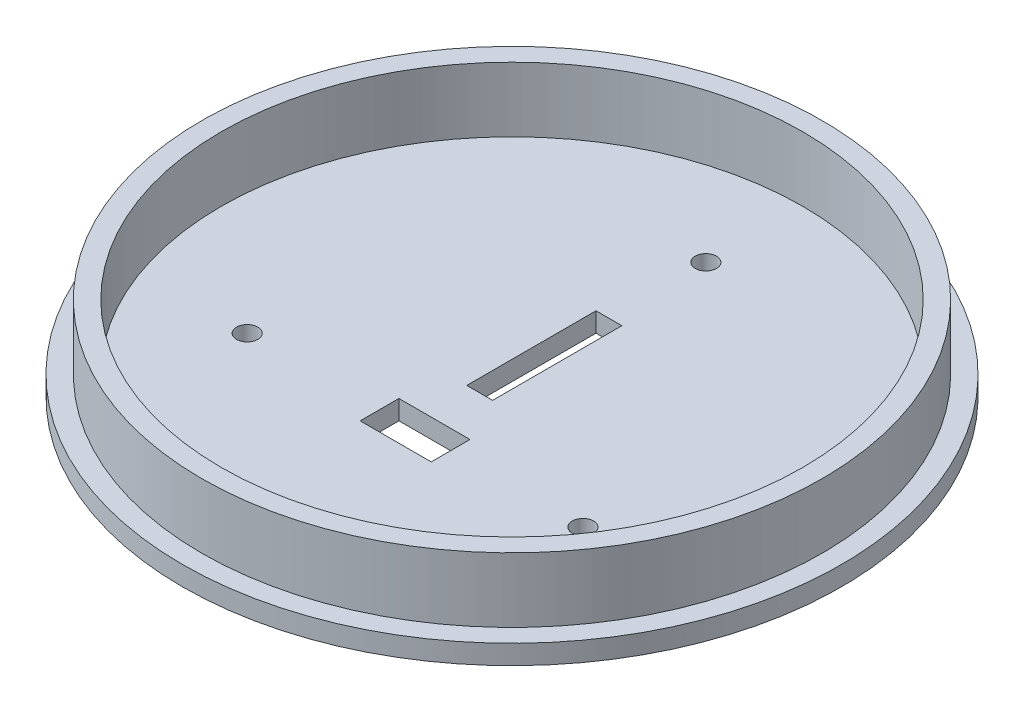
ISO-10303-21;
HEADER;
FILE_DESCRIPTION(('STEP AP214'),'2;1');
FILE_NAME('part.step','',(''),(''),'','','');
FILE_SCHEMA(('AUTOMOTIVE_DESIGN { 1 0 10303 214 1 1 1 1 }'));
ENDSEC;
DATA;
#1=APPLICATION_CONTEXT('core data for automotive mechanical design processes');
#2=APPLICATION_PROTOCOL_DEFINITION('international standard','automotive_design',2000,#1);
#3=PRODUCT_CONTEXT('',#1,'mechanical');
#4=PRODUCT('Part','Part','',(#3));
#5=PRODUCT_RELATED_PRODUCT_CATEGORY('part','',(#4));
#6=PRODUCT_DEFINITION_FORMATION('','',#4);
#7=PRODUCT_DEFINITION_CONTEXT('part definition',#1,'design');
#8=PRODUCT_DEFINITION('design','',#6,#7);
#9=PRODUCT_DEFINITION_SHAPE('','',#8);
#10=(LENGTH_UNIT() NAMED_UNIT(*) SI_UNIT(.MILLI.,.METRE.));
#11=(NAMED_UNIT(*) PLANE_ANGLE_UNIT() SI_UNIT($,.RADIAN.));
#12=(NAMED_UNIT(*) SI_UNIT($,.STERADIAN.) SOLID_ANGLE_UNIT());
#13=UNCERTAINTY_MEASURE_WITH_UNIT(LENGTH_MEASURE(1.E-05),#10,'distance_accuracy_value','');
#14=(GEOMETRIC_REPRESENTATION_CONTEXT(3) GLOBAL_UNCERTAINTY_ASSIGNED_CONTEXT((#13)) GLOBAL_UNIT_ASSIGNED_CONTEXT((#10,
#11,#12)) REPRESENTATION_CONTEXT('',''));
#15=CARTESIAN_POINT('',(0.,0.,0.));
#16=DIRECTION('',(0.,0.,1.));
#17=DIRECTION('',(1.,0.,0.));
#18=AXIS2_PLACEMENT_3D('',#15,#16,#17);
#19=CARTESIAN_POINT('',(0.,3.,0.));
#20=DIRECTION('',(0.,-1.,0.));
#21=DIRECTION('',(0.,0.,-1.));
#22=AXIS2_PLACEMENT_3D('',#19,#20,#21);
#23=CYLINDRICAL_SURFACE('',#22,51.);
#24=CARTESIAN_POINT('',(0.,3.,0.));
#25=DIRECTION('',(0.,1.,0.));
#26=DIRECTION('',(0.,0.,1.));
#27=AXIS2_PLACEMENT_3D('',#24,#25,#26);
#28=CIRCLE('',#27,51.);
#29=CARTESIAN_POINT('',(0.,3.,51.));
#30=VERTEX_POINT('',#29);
#31=EDGE_CURVE('E49',#30,#30,#28,.T.);
#32=ORIENTED_EDGE('',*,*,#31,.F.);
#33=EDGE_LOOP('',(#32));
#34=FACE_BOUND('',#33,.T.);
#35=CARTESIAN_POINT('',(0.,0.,0.));
#36=DIRECTION('',(0.,1.,0.));
#37=DIRECTION('',(0.,0.,1.));
#38=AXIS2_PLACEMENT_3D('',#35,#36,#37);
#39=CIRCLE('',#38,51.);
#40=CARTESIAN_POINT('',(0.,0.,51.));
#41=VERTEX_POINT('',#40);
#42=EDGE_CURVE('E201',#41,#41,#39,.T.);
#43=ORIENTED_EDGE('',*,*,#42,.T.);
#44=EDGE_LOOP('',(#43));
#45=FACE_BOUND('',#44,.T.);
#46=ADVANCED_FACE('F42',(#34,#45),#23,.T.);
#47=CARTESIAN_POINT('',(0.,3.,0.));
#48=DIRECTION('',(0.,1.,0.));
#49=DIRECTION('',(0.,0.,1.));
#50=AXIS2_PLACEMENT_3D('',#47,#48,#49);
#51=PLANE('',#50);
#52=CARTESIAN_POINT('',(0.,3.,0.));
#53=DIRECTION('',(0.,1.,0.));
#54=DIRECTION('',(0.,0.,1.));
#55=AXIS2_PLACEMENT_3D('',#52,#53,#54);
#56=CIRCLE('',#55,48.);
#57=CARTESIAN_POINT('',(0.,3.,48.));
#58=VERTEX_POINT('',#57);
#59=EDGE_CURVE('E194',#58,#58,#56,.T.);
#60=ORIENTED_EDGE('',*,*,#59,.F.);
#61=EDGE_LOOP('',(#60));
#62=FACE_BOUND('',#61,.T.);
#63=ORIENTED_EDGE('',*,*,#31,.T.);
#64=EDGE_LOOP('',(#63));
#65=FACE_BOUND('',#64,.T.);
#66=ADVANCED_FACE('F212',(#62,#65),#51,.T.);
#67=CARTESIAN_POINT('',(0.,0.,0.));
#68=DIRECTION('',(0.,1.,0.));
#69=DIRECTION('',(0.,0.,1.));
#70=AXIS2_PLACEMENT_3D('',#67,#68,#69);
#71=PLANE('',#70);
#72=DIRECTION('',(1.,0.,0.));
#73=VECTOR('',#72,1.);
#74=CARTESIAN_POINT('',(0.,0.,5.00000000000003));
#75=LINE('',#74,#73);
#76=CARTESIAN_POINT('',(-2.,0.,5.00000000000003));
#77=VERTEX_POINT('',#76);
#78=CARTESIAN_POINT('',(2.,0.,5.00000000000003));
#79=VERTEX_POINT('',#78);
#80=EDGE_CURVE('E170',#77,#79,#75,.T.);
#81=ORIENTED_EDGE('',*,*,#80,.T.);
#82=DIRECTION('',(0.,0.,-1.));
#83=VECTOR('',#82,1.);
#84=CARTESIAN_POINT('',(2.,0.,0.));
#85=LINE('',#84,#83);
#86=CARTESIAN_POINT('',(2.,0.,-15.));
#87=VERTEX_POINT('',#86);
#88=EDGE_CURVE('E173',#79,#87,#85,.T.);
#89=ORIENTED_EDGE('',*,*,#88,.T.);
#90=DIRECTION('',(-1.,0.,0.));
#91=VECTOR('',#90,1.);
#92=CARTESIAN_POINT('',(0.,0.,-15.));
#93=LINE('',#92,#91);
#94=CARTESIAN_POINT('',(-2.,0.,-15.));
#95=VERTEX_POINT('',#94);
#96=EDGE_CURVE('E167',#87,#95,#93,.T.);
#97=ORIENTED_EDGE('',*,*,#96,.T.);
#98=DIRECTION('',(0.,0.,1.));
#99=VECTOR('',#98,1.);
#100=CARTESIAN_POINT('',(-2.,0.,0.));
#101=LINE('',#100,#99);
#102=EDGE_CURVE('E111',#95,#77,#101,.T.);
#103=ORIENTED_EDGE('',*,*,#102,.T.);
#104=EDGE_LOOP('',(#81,#89,#97,#103));
#105=FACE_BOUND('',#104,.T.);
#106=DIRECTION('',(1.,0.,0.));
#107=VECTOR('',#106,1.);
#108=CARTESIAN_POINT('',(0.,0.,18.0000000000001));
#109=LINE('',#108,#107);
#110=CARTESIAN_POINT('',(-5.5,0.,18.0000000000001));
#111=VERTEX_POINT('',#110);
#112=CARTESIAN_POINT('',(5.5,0.,18.0000000000001));
#113=VERTEX_POINT('',#112);
#114=EDGE_CURVE('E161',#111,#113,#109,.T.);
#115=ORIENTED_EDGE('',*,*,#114,.T.);
#116=DIRECTION('',(0.,0.,-1.));
#117=VECTOR('',#116,1.);
#118=CARTESIAN_POINT('',(5.5,0.,0.));
#119=LINE('',#118,#117);
#120=CARTESIAN_POINT('',(5.5,0.,12.0000000000001));
#121=VERTEX_POINT('',#120);
#122=EDGE_CURVE('E164',#113,#121,#119,.T.);
#123=ORIENTED_EDGE('',*,*,#122,.T.);
#124=DIRECTION('',(-1.,0.,0.));
#125=VECTOR('',#124,1.);
#126=CARTESIAN_POINT('',(0.,0.,12.0000000000001));
#127=LINE('',#126,#125);
#128=CARTESIAN_POINT('',(-5.5,0.,12.0000000000001));
#129=VERTEX_POINT('',#128);
#130=EDGE_CURVE('E135',#121,#129,#127,.T.);
#131=ORIENTED_EDGE('',*,*,#130,.T.);
#132=DIRECTION('',(0.,0.,1.));
#133=VECTOR('',#132,1.);
#134=CARTESIAN_POINT('',(-5.5,0.,0.));
#135=LINE('',#134,#133);
#136=EDGE_CURVE('E158',#129,#111,#135,.T.);
#137=ORIENTED_EDGE('',*,*,#136,.T.);
#138=EDGE_LOOP('',(#115,#123,#131,#137));
#139=FACE_BOUND('',#138,.T.);
#140=CARTESIAN_POINT('',(-25.9807621135331,0.,15.0000000000001));
#141=DIRECTION('',(0.,1.,0.));
#142=DIRECTION('',(0.,0.,1.));
#143=AXIS2_PLACEMENT_3D('',#140,#141,#142);
#144=CIRCLE('',#143,1.65);
#145=CARTESIAN_POINT('',(-25.9807621135331,0.,16.6500000000001));
#146=VERTEX_POINT('',#145);
#147=EDGE_CURVE('E185',#146,#146,#144,.T.);
#148=ORIENTED_EDGE('',*,*,#147,.T.);
#149=EDGE_LOOP('',(#148));
#150=FACE_BOUND('',#149,.T.);
#151=CARTESIAN_POINT('',(25.9807621135333,0.,14.9999999999998));
#152=DIRECTION('',(0.,1.,0.));
#153=DIRECTION('',(0.,0.,1.));
#154=AXIS2_PLACEMENT_3D('',#151,#152,#153);
#155=CIRCLE('',#154,1.65);
#156=CARTESIAN_POINT('',(25.9807621135333,0.,16.6499999999998));
#157=VERTEX_POINT('',#156);
#158=EDGE_CURVE('E180',#157,#157,#155,.T.);
#159=ORIENTED_EDGE('',*,*,#158,.T.);
#160=EDGE_LOOP('',(#159));
#161=FACE_BOUND('',#160,.T.);
#162=CARTESIAN_POINT('',(0.,0.,-30.));
#163=DIRECTION('',(0.,1.,0.));
#164=DIRECTION('',(0.,0.,1.));
#165=AXIS2_PLACEMENT_3D('',#162,#163,#164);
#166=CIRCLE('',#165,1.65);
#167=CARTESIAN_POINT('',(0.,0.,-28.35));
#168=VERTEX_POINT('',#167);
#169=EDGE_CURVE('E191',#168,#168,#166,.T.);
#170=ORIENTED_EDGE('',*,*,#169,.T.);
#171=EDGE_LOOP('',(#170));
#172=FACE_BOUND('',#171,.T.);
#173=ORIENTED_EDGE('',*,*,#42,.F.);
#174=EDGE_LOOP('',(#173));
#175=FACE_BOUND('',#174,.T.);
#176=ADVANCED_FACE('F209',(#105,#139,#150,#161,#172,#175),#71,.F.);
#177=CARTESIAN_POINT('',(0.,13.,0.));
#178=DIRECTION('',(0.,-1.,0.));
#179=DIRECTION('',(0.,0.,-1.));
#180=AXIS2_PLACEMENT_3D('',#177,#178,#179);
#181=CYLINDRICAL_SURFACE('',#180,45.);
#182=CARTESIAN_POINT('',(0.,13.,0.));
#183=DIRECTION('',(0.,1.,0.));
#184=DIRECTION('',(0.,0.,1.));
#185=AXIS2_PLACEMENT_3D('',#182,#183,#184);
#186=CIRCLE('',#185,45.);
#187=CARTESIAN_POINT('',(0.,13.,45.));
#188=VERTEX_POINT('',#187);
#189=EDGE_CURVE('E195',#188,#188,#186,.T.);
#190=ORIENTED_EDGE('',*,*,#189,.T.);
#191=EDGE_LOOP('',(#190));
#192=FACE_BOUND('',#191,.T.);
#193=CARTESIAN_POINT('',(0.,3.,0.));
#194=DIRECTION('',(0.,1.,0.));
#195=DIRECTION('',(0.,0.,1.));
#196=AXIS2_PLACEMENT_3D('',#193,#194,#195);
#197=CIRCLE('',#196,45.);
#198=CARTESIAN_POINT('',(0.,3.,45.));
#199=VERTEX_POINT('',#198);
#200=EDGE_CURVE('E11',#199,#199,#197,.F.);
#201=ORIENTED_EDGE('',*,*,#200,.T.);
#202=EDGE_LOOP('',(#201));
#203=FACE_BOUND('',#202,.T.);
#204=ADVANCED_FACE('F211',(#192,#203),#181,.F.);
#205=CARTESIAN_POINT('',(0.,13.,0.));
#206=DIRECTION('',(0.,-1.,0.));
#207=DIRECTION('',(0.,0.,-1.));
#208=AXIS2_PLACEMENT_3D('',#205,#206,#207);
#209=CYLINDRICAL_SURFACE('',#208,48.);
#210=CARTESIAN_POINT('',(0.,13.,0.));
#211=DIRECTION('',(0.,1.,0.));
#212=DIRECTION('',(0.,0.,1.));
#213=AXIS2_PLACEMENT_3D('',#210,#211,#212);
#214=CIRCLE('',#213,48.);
#215=CARTESIAN_POINT('',(0.,13.,48.));
#216=VERTEX_POINT('',#215);
#217=EDGE_CURVE('E198',#216,#216,#214,.T.);
#218=ORIENTED_EDGE('',*,*,#217,.F.);
#219=EDGE_LOOP('',(#218));
#220=FACE_BOUND('',#219,.T.);
#221=ORIENTED_EDGE('',*,*,#59,.T.);
#222=EDGE_LOOP('',(#221));
#223=FACE_BOUND('',#222,.T.);
#224=ADVANCED_FACE('F218',(#220,#223),#209,.T.);
#225=CARTESIAN_POINT('',(0.,13.,0.));
#226=DIRECTION('',(0.,1.,0.));
#227=DIRECTION('',(0.,0.,1.));
#228=AXIS2_PLACEMENT_3D('',#225,#226,#227);
#229=PLANE('',#228);
#230=ORIENTED_EDGE('',*,*,#189,.F.);
#231=EDGE_LOOP('',(#230));
#232=FACE_BOUND('',#231,.T.);
#233=ORIENTED_EDGE('',*,*,#217,.T.);
#234=EDGE_LOOP('',(#233));
#235=FACE_BOUND('',#234,.T.);
#236=ADVANCED_FACE('F253',(#232,#235),#229,.T.);
#237=DIRECTION('',(0.,0.,-1.));
#238=VECTOR('',#237,1.);
#239=CARTESIAN_POINT('',(2.,3.,5.00000000000003));
#240=LINE('',#239,#238);
#241=CARTESIAN_POINT('',(2.,3.,5.00000000000003));
#242=VERTEX_POINT('',#241);
#243=CARTESIAN_POINT('',(2.,3.,-15.));
#244=VERTEX_POINT('',#243);
#245=EDGE_CURVE('E123',#242,#244,#240,.T.);
#246=ORIENTED_EDGE('',*,*,#245,.F.);
#247=DIRECTION('',(1.,0.,0.));
#248=VECTOR('',#247,1.);
#249=CARTESIAN_POINT('',(-2.,3.,5.00000000000003));
#250=LINE('',#249,#248);
#251=CARTESIAN_POINT('',(-2.,3.,5.00000000000003));
#252=VERTEX_POINT('',#251);
#253=EDGE_CURVE('E128',#252,#242,#250,.T.);
#254=ORIENTED_EDGE('',*,*,#253,.F.);
#255=DIRECTION('',(0.,0.,1.));
#256=VECTOR('',#255,1.);
#257=CARTESIAN_POINT('',(-2.,3.,5.00000000000003));
#258=LINE('',#257,#256);
#259=CARTESIAN_POINT('',(-2.,3.,-15.));
#260=VERTEX_POINT('',#259);
#261=EDGE_CURVE('E108',#260,#252,#258,.T.);
#262=ORIENTED_EDGE('',*,*,#261,.F.);
#263=DIRECTION('',(-1.,0.,0.));
#264=VECTOR('',#263,1.);
#265=CARTESIAN_POINT('',(-2.,3.,-15.));
#266=LINE('',#265,#264);
#267=EDGE_CURVE('E118',#244,#260,#266,.T.);
#268=ORIENTED_EDGE('',*,*,#267,.F.);
#269=EDGE_LOOP('',(#246,#254,#262,#268));
#270=FACE_BOUND('',#269,.T.);
#271=DIRECTION('',(0.,0.,-1.));
#272=VECTOR('',#271,1.);
#273=CARTESIAN_POINT('',(5.5,3.,12.0000000000001));
#274=LINE('',#273,#272);
#275=CARTESIAN_POINT('',(5.5,3.,18.0000000000001));
#276=VERTEX_POINT('',#275);
#277=CARTESIAN_POINT('',(5.5,3.,12.0000000000001));
#278=VERTEX_POINT('',#277);
#279=EDGE_CURVE('E154',#276,#278,#274,.T.);
#280=ORIENTED_EDGE('',*,*,#279,.F.);
#281=DIRECTION('',(1.,0.,0.));
#282=VECTOR('',#281,1.);
#283=CARTESIAN_POINT('',(-5.5,3.,18.0000000000001));
#284=LINE('',#283,#282);
#285=CARTESIAN_POINT('',(-5.5,3.,18.0000000000001));
#286=VERTEX_POINT('',#285);
#287=EDGE_CURVE('E141',#286,#276,#284,.T.);
#288=ORIENTED_EDGE('',*,*,#287,.F.);
#289=DIRECTION('',(0.,0.,1.));
#290=VECTOR('',#289,1.);
#291=CARTESIAN_POINT('',(-5.5,3.,12.0000000000001));
#292=LINE('',#291,#290);
#293=CARTESIAN_POINT('',(-5.5,3.,12.0000000000001));
#294=VERTEX_POINT('',#293);
#295=EDGE_CURVE('E149',#294,#286,#292,.T.);
#296=ORIENTED_EDGE('',*,*,#295,.F.);
#297=DIRECTION('',(-1.,0.,0.));
#298=VECTOR('',#297,1.);
#299=CARTESIAN_POINT('',(-5.5,3.,12.0000000000001));
#300=LINE('',#299,#298);
#301=EDGE_CURVE('E152',#278,#294,#300,.T.);
#302=ORIENTED_EDGE('',*,*,#301,.F.);
#303=EDGE_LOOP('',(#280,#288,#296,#302));
#304=FACE_BOUND('',#303,.T.);
#305=CARTESIAN_POINT('',(-25.9807621135331,3.,15.0000000000001));
#306=DIRECTION('',(0.,1.,0.));
#307=DIRECTION('',(0.866025403784436,0.,-0.500000000000004));
#308=AXIS2_PLACEMENT_3D('',#305,#306,#307);
#309=CIRCLE('',#308,1.65);
#310=CARTESIAN_POINT('',(-24.5518201972888,3.,14.1750000000001));
#311=VERTEX_POINT('',#310);
#312=EDGE_CURVE('E177',#311,#311,#309,.T.);
#313=ORIENTED_EDGE('',*,*,#312,.F.);
#314=EDGE_LOOP('',(#313));
#315=FACE_BOUND('',#314,.T.);
#316=CARTESIAN_POINT('',(25.9807621135333,3.,14.9999999999998));
#317=DIRECTION('',(0.,1.,0.));
#318=DIRECTION('',(-0.866025403784443,0.,-0.499999999999992));
#319=AXIS2_PLACEMENT_3D('',#316,#317,#318);
#320=CIRCLE('',#319,1.65);
#321=CARTESIAN_POINT('',(24.551820197289,3.,14.1749999999998));
#322=VERTEX_POINT('',#321);
#323=EDGE_CURVE('E176',#322,#322,#320,.T.);
#324=ORIENTED_EDGE('',*,*,#323,.F.);
#325=EDGE_LOOP('',(#324));
#326=FACE_BOUND('',#325,.T.);
#327=CARTESIAN_POINT('',(0.,3.,-30.));
#328=DIRECTION('',(0.,1.,0.));
#329=DIRECTION('',(0.,0.,1.));
#330=AXIS2_PLACEMENT_3D('',#327,#328,#329);
#331=CIRCLE('',#330,1.65);
#332=CARTESIAN_POINT('',(0.,3.,-28.35));
#333=VERTEX_POINT('',#332);
#334=EDGE_CURVE('E188',#333,#333,#331,.T.);
#335=ORIENTED_EDGE('',*,*,#334,.F.);
#336=EDGE_LOOP('',(#335));
#337=FACE_BOUND('',#336,.T.);
#338=ORIENTED_EDGE('',*,*,#200,.F.);
#339=EDGE_LOOP('',(#338));
#340=FACE_BOUND('',#339,.T.);
#341=ADVANCED_FACE('F125',(#270,#304,#315,#326,#337,#340),#51,.T.);
#342=CARTESIAN_POINT('',(0.,-7.,-30.));
#343=DIRECTION('',(0.,1.,0.));
#344=DIRECTION('',(0.,0.,1.));
#345=AXIS2_PLACEMENT_3D('',#342,#343,#344);
#346=CYLINDRICAL_SURFACE('',#345,1.65);
#347=ORIENTED_EDGE('',*,*,#334,.T.);
#348=EDGE_LOOP('',(#347));
#349=FACE_BOUND('',#348,.T.);
#350=ORIENTED_EDGE('',*,*,#169,.F.);
#351=EDGE_LOOP('',(#350));
#352=FACE_BOUND('',#351,.T.);
#353=ADVANCED_FACE('F272',(#349,#352),#346,.F.);
#354=CARTESIAN_POINT('',(25.9807621135333,-7.,14.9999999999998));
#355=DIRECTION('',(0.,1.,0.));
#356=DIRECTION('',(0.,0.,1.));
#357=AXIS2_PLACEMENT_3D('',#354,#355,#356);
#358=CYLINDRICAL_SURFACE('',#357,1.65);
#359=ORIENTED_EDGE('',*,*,#323,.T.);
#360=EDGE_LOOP('',(#359));
#361=FACE_BOUND('',#360,.T.);
#362=ORIENTED_EDGE('',*,*,#158,.F.);
#363=EDGE_LOOP('',(#362));
#364=FACE_BOUND('',#363,.T.);
#365=ADVANCED_FACE('F276',(#361,#364),#358,.F.);
#366=CARTESIAN_POINT('',(-25.9807621135331,-7.,15.0000000000001));
#367=DIRECTION('',(0.,1.,0.));
#368=DIRECTION('',(0.,0.,1.));
#369=AXIS2_PLACEMENT_3D('',#366,#367,#368);
#370=CYLINDRICAL_SURFACE('',#369,1.65);
#371=ORIENTED_EDGE('',*,*,#312,.T.);
#372=EDGE_LOOP('',(#371));
#373=FACE_BOUND('',#372,.T.);
#374=ORIENTED_EDGE('',*,*,#147,.F.);
#375=EDGE_LOOP('',(#374));
#376=FACE_BOUND('',#375,.T.);
#377=ADVANCED_FACE('F287',(#373,#376),#370,.F.);
#378=CARTESIAN_POINT('',(5.5,-7.,12.0000000000001));
#379=DIRECTION('',(1.,0.,0.));
#380=DIRECTION('',(0.,0.,-1.));
#381=AXIS2_PLACEMENT_3D('',#378,#379,#380);
#382=PLANE('',#381);
#383=DIRECTION('',(0.,1.,0.));
#384=VECTOR('',#383,1.);
#385=CARTESIAN_POINT('',(5.5,-7.,18.0000000000001));
#386=LINE('',#385,#384);
#387=EDGE_CURVE('E145',#113,#276,#386,.T.);
#388=ORIENTED_EDGE('',*,*,#387,.T.);
#389=ORIENTED_EDGE('',*,*,#279,.T.);
#390=DIRECTION('',(0.,1.,0.));
#391=VECTOR('',#390,1.);
#392=CARTESIAN_POINT('',(5.5,-7.,12.0000000000001));
#393=LINE('',#392,#391);
#394=EDGE_CURVE('E138',#121,#278,#393,.T.);
#395=ORIENTED_EDGE('',*,*,#394,.F.);
#396=ORIENTED_EDGE('',*,*,#122,.F.);
#397=EDGE_LOOP('',(#388,#389,#395,#396));
#398=FACE_BOUND('',#397,.T.);
#399=ADVANCED_FACE('F297',(#398),#382,.F.);
#400=CARTESIAN_POINT('',(-5.5,-7.,18.0000000000001));
#401=DIRECTION('',(0.,0.,1.));
#402=DIRECTION('',(1.,0.,0.));
#403=AXIS2_PLACEMENT_3D('',#400,#401,#402);
#404=PLANE('',#403);
#405=DIRECTION('',(0.,1.,0.));
#406=VECTOR('',#405,1.);
#407=CARTESIAN_POINT('',(-5.5,-7.,18.0000000000001));
#408=LINE('',#407,#406);
#409=EDGE_CURVE('E143',#111,#286,#408,.T.);
#410=ORIENTED_EDGE('',*,*,#409,.T.);
#411=ORIENTED_EDGE('',*,*,#287,.T.);
#412=ORIENTED_EDGE('',*,*,#387,.F.);
#413=ORIENTED_EDGE('',*,*,#114,.F.);
#414=EDGE_LOOP('',(#410,#411,#412,#413));
#415=FACE_BOUND('',#414,.T.);
#416=ADVANCED_FACE('F319',(#415),#404,.F.);
#417=CARTESIAN_POINT('',(-5.5,-7.,12.0000000000001));
#418=DIRECTION('',(-1.,0.,0.));
#419=DIRECTION('',(0.,0.,1.));
#420=AXIS2_PLACEMENT_3D('',#417,#418,#419);
#421=PLANE('',#420);
#422=DIRECTION('',(0.,1.,0.));
#423=VECTOR('',#422,1.);
#424=CARTESIAN_POINT('',(-5.5,-7.,12.0000000000001));
#425=LINE('',#424,#423);
#426=EDGE_CURVE('E64',#129,#294,#425,.T.);
#427=ORIENTED_EDGE('',*,*,#426,.T.);
#428=ORIENTED_EDGE('',*,*,#295,.T.);
#429=ORIENTED_EDGE('',*,*,#409,.F.);
#430=ORIENTED_EDGE('',*,*,#136,.F.);
#431=EDGE_LOOP('',(#427,#428,#429,#430));
#432=FACE_BOUND('',#431,.T.);
#433=ADVANCED_FACE('F330',(#432),#421,.F.);
#434=CARTESIAN_POINT('',(-5.5,-7.,12.0000000000001));
#435=DIRECTION('',(0.,0.,-1.));
#436=DIRECTION('',(-1.,0.,0.));
#437=AXIS2_PLACEMENT_3D('',#434,#435,#436);
#438=PLANE('',#437);
#439=ORIENTED_EDGE('',*,*,#394,.T.);
#440=ORIENTED_EDGE('',*,*,#301,.T.);
#441=ORIENTED_EDGE('',*,*,#426,.F.);
#442=ORIENTED_EDGE('',*,*,#130,.F.);
#443=EDGE_LOOP('',(#439,#440,#441,#442));
#444=FACE_BOUND('',#443,.T.);
#445=ADVANCED_FACE('F341',(#444),#438,.F.);
#446=CARTESIAN_POINT('',(2.,-7.,5.00000000000003));
#447=DIRECTION('',(1.,0.,0.));
#448=DIRECTION('',(0.,0.,-1.));
#449=AXIS2_PLACEMENT_3D('',#446,#447,#448);
#450=PLANE('',#449);
#451=DIRECTION('',(0.,1.,0.));
#452=VECTOR('',#451,1.);
#453=CARTESIAN_POINT('',(2.,-7.,5.00000000000003));
#454=LINE('',#453,#452);
#455=EDGE_CURVE('E133',#79,#242,#454,.T.);
#456=ORIENTED_EDGE('',*,*,#455,.T.);
#457=ORIENTED_EDGE('',*,*,#245,.T.);
#458=DIRECTION('',(0.,1.,0.));
#459=VECTOR('',#458,1.);
#460=CARTESIAN_POINT('',(2.,-7.,-15.));
#461=LINE('',#460,#459);
#462=EDGE_CURVE('E114',#87,#244,#461,.T.);
#463=ORIENTED_EDGE('',*,*,#462,.F.);
#464=ORIENTED_EDGE('',*,*,#88,.F.);
#465=EDGE_LOOP('',(#456,#457,#463,#464));
#466=FACE_BOUND('',#465,.T.);
#467=ADVANCED_FACE('F352',(#466),#450,.F.);
#468=CARTESIAN_POINT('',(-2.,-7.,5.00000000000003));
#469=DIRECTION('',(0.,0.,1.));
#470=DIRECTION('',(1.,0.,0.));
#471=AXIS2_PLACEMENT_3D('',#468,#469,#470);
#472=PLANE('',#471);
#473=DIRECTION('',(0.,1.,0.));
#474=VECTOR('',#473,1.);
#475=CARTESIAN_POINT('',(-2.,-7.,5.00000000000003));
#476=LINE('',#475,#474);
#477=EDGE_CURVE('E113',#77,#252,#476,.T.);
#478=ORIENTED_EDGE('',*,*,#477,.T.);
#479=ORIENTED_EDGE('',*,*,#253,.T.);
#480=ORIENTED_EDGE('',*,*,#455,.F.);
#481=ORIENTED_EDGE('',*,*,#80,.F.);
#482=EDGE_LOOP('',(#478,#479,#480,#481));
#483=FACE_BOUND('',#482,.T.);
#484=ADVANCED_FACE('F362',(#483),#472,.F.);
#485=CARTESIAN_POINT('',(-2.,-7.,5.00000000000003));
#486=DIRECTION('',(-1.,0.,0.));
#487=DIRECTION('',(0.,0.,1.));
#488=AXIS2_PLACEMENT_3D('',#485,#486,#487);
#489=PLANE('',#488);
#490=DIRECTION('',(0.,1.,0.));
#491=VECTOR('',#490,1.);
#492=CARTESIAN_POINT('',(-2.,-7.,-15.));
#493=LINE('',#492,#491);
#494=EDGE_CURVE('E56',#95,#260,#493,.T.);
#495=ORIENTED_EDGE('',*,*,#494,.T.);
#496=ORIENTED_EDGE('',*,*,#261,.T.);
#497=ORIENTED_EDGE('',*,*,#477,.F.);
#498=ORIENTED_EDGE('',*,*,#102,.F.);
#499=EDGE_LOOP('',(#495,#496,#497,#498));
#500=FACE_BOUND('',#499,.T.);
#501=ADVANCED_FACE('F105',(#500),#489,.F.);
#502=CARTESIAN_POINT('',(-2.,-7.,-15.));
#503=DIRECTION('',(0.,0.,-1.));
#504=DIRECTION('',(-1.,0.,0.));
#505=AXIS2_PLACEMENT_3D('',#502,#503,#504);
#506=PLANE('',#505);
#507=ORIENTED_EDGE('',*,*,#462,.T.);
#508=ORIENTED_EDGE('',*,*,#267,.T.);
#509=ORIENTED_EDGE('',*,*,#494,.F.);
#510=ORIENTED_EDGE('',*,*,#96,.F.);
#511=EDGE_LOOP('',(#507,#508,#509,#510));
#512=FACE_BOUND('',#511,.T.);
#513=ADVANCED_FACE('F119',(#512),#506,.F.);
#514=CLOSED_SHELL('',(#46,#66,#176,#204,#224,#236,#341,#353,#365,#377,#399,#416,#433,#445,#467,
#484,#501,#513));
#515=MANIFOLD_SOLID_BREP('B2',#514);
#516=ADVANCED_BREP_SHAPE_REPRESENTATION('',(#18,#515),#14);
#517=SHAPE_DEFINITION_REPRESENTATION(#9,#516);
ENDSEC;
END-ISO-10303-21;
